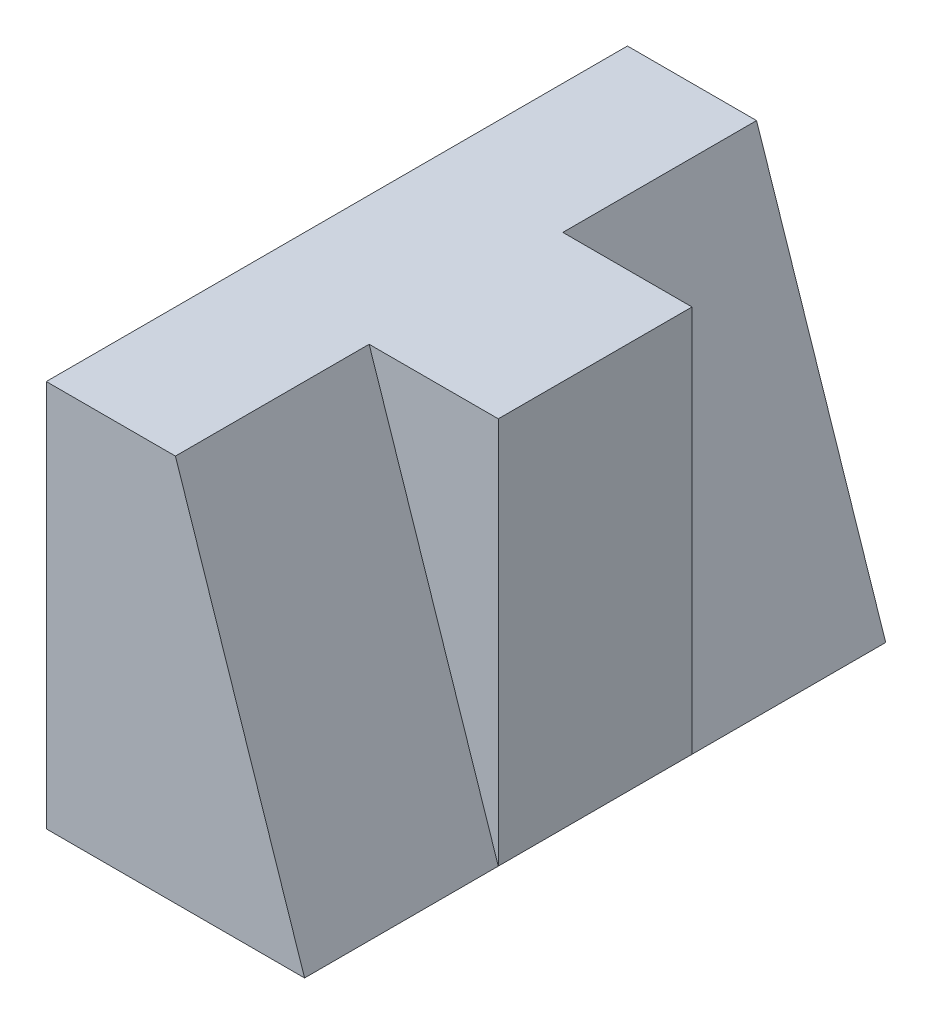
ISO-10303-21;
HEADER;
FILE_DESCRIPTION(('STEP AP214'),'2;1');
FILE_NAME('part.step','',(''),(''),'','','');
FILE_SCHEMA(('AUTOMOTIVE_DESIGN { 1 0 10303 214 1 1 1 1 }'));
ENDSEC;
DATA;
#1=APPLICATION_CONTEXT('core data for automotive mechanical design processes');
#2=APPLICATION_PROTOCOL_DEFINITION('international standard','automotive_design',2000,#1);
#3=PRODUCT_CONTEXT('',#1,'mechanical');
#4=PRODUCT('Part','Part','',(#3));
#5=PRODUCT_RELATED_PRODUCT_CATEGORY('part','',(#4));
#6=PRODUCT_DEFINITION_FORMATION('','',#4);
#7=PRODUCT_DEFINITION_CONTEXT('part definition',#1,'design');
#8=PRODUCT_DEFINITION('design','',#6,#7);
#9=PRODUCT_DEFINITION_SHAPE('','',#8);
#10=(LENGTH_UNIT() NAMED_UNIT(*) SI_UNIT(.MILLI.,.METRE.));
#11=(NAMED_UNIT(*) PLANE_ANGLE_UNIT() SI_UNIT($,.RADIAN.));
#12=(NAMED_UNIT(*) SI_UNIT($,.STERADIAN.) SOLID_ANGLE_UNIT());
#13=UNCERTAINTY_MEASURE_WITH_UNIT(LENGTH_MEASURE(1.E-05),#10,'distance_accuracy_value','');
#14=(GEOMETRIC_REPRESENTATION_CONTEXT(3) GLOBAL_UNCERTAINTY_ASSIGNED_CONTEXT((#13)) GLOBAL_UNIT_ASSIGNED_CONTEXT((#10,
#11,#12)) REPRESENTATION_CONTEXT('',''));
#15=CARTESIAN_POINT('',(0.,0.,0.));
#16=DIRECTION('',(0.,0.,1.));
#17=DIRECTION('',(1.,0.,0.));
#18=AXIS2_PLACEMENT_3D('',#15,#16,#17);
#19=CARTESIAN_POINT('',(36.,12.,45.));
#20=DIRECTION('',(0.948683298050514,0.316227766016838,0.));
#21=DIRECTION('',(-0.316227766016838,0.948683298050514,0.));
#22=AXIS2_PLACEMENT_3D('',#19,#20,#21);
#23=PLANE('',#22);
#24=DIRECTION('',(0.,0.,-1.));
#25=VECTOR('',#24,1.);
#26=CARTESIAN_POINT('',(20.,60.,45.));
#27=LINE('',#26,#25);
#28=CARTESIAN_POINT('',(20.,60.,-15.));
#29=VERTEX_POINT('',#28);
#30=CARTESIAN_POINT('',(20.,60.,-45.));
#31=VERTEX_POINT('',#30);
#32=EDGE_CURVE('E44',#29,#31,#27,.T.);
#33=ORIENTED_EDGE('',*,*,#32,.F.);
#34=DIRECTION('',(0.316227766016838,-0.948683298050514,0.));
#35=VECTOR('',#34,1.);
#36=CARTESIAN_POINT('',(36.,12.,-15.));
#37=LINE('',#36,#35);
#38=CARTESIAN_POINT('',(40.,0.,-15.));
#39=VERTEX_POINT('',#38);
#40=EDGE_CURVE('E52',#29,#39,#37,.T.);
#41=ORIENTED_EDGE('',*,*,#40,.T.);
#42=DIRECTION('',(0.,0.,-1.));
#43=VECTOR('',#42,1.);
#44=CARTESIAN_POINT('',(40.,0.,45.));
#45=LINE('',#44,#43);
#46=CARTESIAN_POINT('',(40.,0.,-45.));
#47=VERTEX_POINT('',#46);
#48=EDGE_CURVE('E102',#39,#47,#45,.T.);
#49=ORIENTED_EDGE('',*,*,#48,.T.);
#50=DIRECTION('',(0.316227766016838,-0.948683298050514,0.));
#51=VECTOR('',#50,1.);
#52=CARTESIAN_POINT('',(36.,12.,-45.));
#53=LINE('',#52,#51);
#54=EDGE_CURVE('E111',#31,#47,#53,.T.);
#55=ORIENTED_EDGE('',*,*,#54,.F.);
#56=EDGE_LOOP('',(#33,#41,#49,#55));
#57=FACE_BOUND('',#56,.T.);
#58=ADVANCED_FACE('F35',(#57),#23,.T.);
#59=DIRECTION('',(0.316227766016838,-0.948683298050514,0.));
#60=VECTOR('',#59,1.);
#61=CARTESIAN_POINT('',(36.,12.,15.));
#62=LINE('',#61,#60);
#63=CARTESIAN_POINT('',(20.,60.,15.));
#64=VERTEX_POINT('',#63);
#65=CARTESIAN_POINT('',(40.,0.,15.));
#66=VERTEX_POINT('',#65);
#67=EDGE_CURVE('E96',#64,#66,#62,.T.);
#68=ORIENTED_EDGE('',*,*,#67,.F.);
#69=CARTESIAN_POINT('',(20.,60.,45.));
#70=VERTEX_POINT('',#69);
#71=EDGE_CURVE('E11',#70,#64,#27,.T.);
#72=ORIENTED_EDGE('',*,*,#71,.F.);
#73=DIRECTION('',(0.316227766016838,-0.948683298050514,0.));
#74=VECTOR('',#73,1.);
#75=CARTESIAN_POINT('',(36.,12.,45.));
#76=LINE('',#75,#74);
#77=CARTESIAN_POINT('',(40.,0.,45.));
#78=VERTEX_POINT('',#77);
#79=EDGE_CURVE('E98',#70,#78,#76,.T.);
#80=ORIENTED_EDGE('',*,*,#79,.T.);
#81=EDGE_CURVE('E93',#78,#66,#45,.T.);
#82=ORIENTED_EDGE('',*,*,#81,.T.);
#83=EDGE_LOOP('',(#68,#72,#80,#82));
#84=FACE_BOUND('',#83,.T.);
#85=ADVANCED_FACE('F37',(#84),#23,.T.);
#86=CARTESIAN_POINT('',(0.,60.,45.));
#87=DIRECTION('',(0.,1.,0.));
#88=DIRECTION('',(0.,0.,1.));
#89=AXIS2_PLACEMENT_3D('',#86,#87,#88);
#90=PLANE('',#89);
#91=DIRECTION('',(1.,0.,0.));
#92=VECTOR('',#91,1.);
#93=CARTESIAN_POINT('',(0.,60.,-45.));
#94=LINE('',#93,#92);
#95=CARTESIAN_POINT('',(0.,60.,-45.));
#96=VERTEX_POINT('',#95);
#97=EDGE_CURVE('E155',#96,#31,#94,.T.);
#98=ORIENTED_EDGE('',*,*,#97,.F.);
#99=DIRECTION('',(0.,0.,-1.));
#100=VECTOR('',#99,1.);
#101=CARTESIAN_POINT('',(0.,60.,45.));
#102=LINE('',#101,#100);
#103=CARTESIAN_POINT('',(0.,60.,45.));
#104=VERTEX_POINT('',#103);
#105=EDGE_CURVE('E169',#104,#96,#102,.T.);
#106=ORIENTED_EDGE('',*,*,#105,.F.);
#107=DIRECTION('',(1.,0.,0.));
#108=VECTOR('',#107,1.);
#109=CARTESIAN_POINT('',(0.,60.,45.));
#110=LINE('',#109,#108);
#111=EDGE_CURVE('E144',#104,#70,#110,.T.);
#112=ORIENTED_EDGE('',*,*,#111,.T.);
#113=ORIENTED_EDGE('',*,*,#71,.T.);
#114=DIRECTION('',(-1.,0.,0.));
#115=VECTOR('',#114,1.);
#116=CARTESIAN_POINT('',(0.,60.,15.));
#117=LINE('',#116,#115);
#118=CARTESIAN_POINT('',(40.,60.,15.));
#119=VERTEX_POINT('',#118);
#120=EDGE_CURVE('E120',#119,#64,#117,.T.);
#121=ORIENTED_EDGE('',*,*,#120,.F.);
#122=DIRECTION('',(0.,0.,-1.));
#123=VECTOR('',#122,1.);
#124=CARTESIAN_POINT('',(40.,60.,15.));
#125=LINE('',#124,#123);
#126=CARTESIAN_POINT('',(40.,60.,-15.));
#127=VERTEX_POINT('',#126);
#128=EDGE_CURVE('E112',#119,#127,#125,.T.);
#129=ORIENTED_EDGE('',*,*,#128,.T.);
#130=DIRECTION('',(-1.,0.,0.));
#131=VECTOR('',#130,1.);
#132=CARTESIAN_POINT('',(0.,60.,-15.));
#133=LINE('',#132,#131);
#134=EDGE_CURVE('E137',#127,#29,#133,.T.);
#135=ORIENTED_EDGE('',*,*,#134,.T.);
#136=ORIENTED_EDGE('',*,*,#32,.T.);
#137=EDGE_LOOP('',(#98,#106,#112,#113,#121,#129,#135,#136));
#138=FACE_BOUND('',#137,.T.);
#139=ADVANCED_FACE('F181',(#138),#90,.T.);
#140=CARTESIAN_POINT('',(0.,0.,45.));
#141=DIRECTION('',(-1.,0.,0.));
#142=DIRECTION('',(0.,0.,1.));
#143=AXIS2_PLACEMENT_3D('',#140,#141,#142);
#144=PLANE('',#143);
#145=DIRECTION('',(0.,1.,0.));
#146=VECTOR('',#145,1.);
#147=CARTESIAN_POINT('',(0.,0.,-45.));
#148=LINE('',#147,#146);
#149=CARTESIAN_POINT('',(0.,0.,-45.));
#150=VERTEX_POINT('',#149);
#151=EDGE_CURVE('E158',#150,#96,#148,.T.);
#152=ORIENTED_EDGE('',*,*,#151,.F.);
#153=DIRECTION('',(0.,0.,-1.));
#154=VECTOR('',#153,1.);
#155=CARTESIAN_POINT('',(0.,0.,45.));
#156=LINE('',#155,#154);
#157=CARTESIAN_POINT('',(0.,0.,45.));
#158=VERTEX_POINT('',#157);
#159=EDGE_CURVE('E101',#158,#150,#156,.T.);
#160=ORIENTED_EDGE('',*,*,#159,.F.);
#161=DIRECTION('',(0.,1.,0.));
#162=VECTOR('',#161,1.);
#163=CARTESIAN_POINT('',(0.,0.,45.));
#164=LINE('',#163,#162);
#165=EDGE_CURVE('E148',#158,#104,#164,.T.);
#166=ORIENTED_EDGE('',*,*,#165,.T.);
#167=ORIENTED_EDGE('',*,*,#105,.T.);
#168=EDGE_LOOP('',(#152,#160,#166,#167));
#169=FACE_BOUND('',#168,.T.);
#170=ADVANCED_FACE('F179',(#169),#144,.T.);
#171=CARTESIAN_POINT('',(0.,0.,45.));
#172=DIRECTION('',(0.,1.,0.));
#173=DIRECTION('',(0.,0.,1.));
#174=AXIS2_PLACEMENT_3D('',#171,#172,#173);
#175=PLANE('',#174);
#176=DIRECTION('',(1.,0.,0.));
#177=VECTOR('',#176,1.);
#178=CARTESIAN_POINT('',(0.,0.,-45.));
#179=LINE('',#178,#177);
#180=EDGE_CURVE('E145',#150,#47,#179,.T.);
#181=ORIENTED_EDGE('',*,*,#180,.T.);
#182=ORIENTED_EDGE('',*,*,#48,.F.);
#183=DIRECTION('',(0.,0.,-1.));
#184=VECTOR('',#183,1.);
#185=CARTESIAN_POINT('',(40.,0.,15.));
#186=LINE('',#185,#184);
#187=EDGE_CURVE('E105',#66,#39,#186,.T.);
#188=ORIENTED_EDGE('',*,*,#187,.F.);
#189=ORIENTED_EDGE('',*,*,#81,.F.);
#190=DIRECTION('',(1.,0.,0.));
#191=VECTOR('',#190,1.);
#192=CARTESIAN_POINT('',(0.,0.,45.));
#193=LINE('',#192,#191);
#194=EDGE_CURVE('E151',#158,#78,#193,.T.);
#195=ORIENTED_EDGE('',*,*,#194,.F.);
#196=ORIENTED_EDGE('',*,*,#159,.T.);
#197=EDGE_LOOP('',(#181,#182,#188,#189,#195,#196));
#198=FACE_BOUND('',#197,.T.);
#199=ADVANCED_FACE('F107',(#198),#175,.F.);
#200=CARTESIAN_POINT('',(0.,0.,45.));
#201=DIRECTION('',(0.,0.,1.));
#202=DIRECTION('',(1.,0.,0.));
#203=AXIS2_PLACEMENT_3D('',#200,#201,#202);
#204=PLANE('',#203);
#205=ORIENTED_EDGE('',*,*,#79,.F.);
#206=ORIENTED_EDGE('',*,*,#111,.F.);
#207=ORIENTED_EDGE('',*,*,#165,.F.);
#208=ORIENTED_EDGE('',*,*,#194,.T.);
#209=EDGE_LOOP('',(#205,#206,#207,#208));
#210=FACE_BOUND('',#209,.T.);
#211=ADVANCED_FACE('F187',(#210),#204,.T.);
#212=CARTESIAN_POINT('',(0.,0.,-45.));
#213=DIRECTION('',(0.,0.,1.));
#214=DIRECTION('',(1.,0.,0.));
#215=AXIS2_PLACEMENT_3D('',#212,#213,#214);
#216=PLANE('',#215);
#217=ORIENTED_EDGE('',*,*,#54,.T.);
#218=ORIENTED_EDGE('',*,*,#180,.F.);
#219=ORIENTED_EDGE('',*,*,#151,.T.);
#220=ORIENTED_EDGE('',*,*,#97,.T.);
#221=EDGE_LOOP('',(#217,#218,#219,#220));
#222=FACE_BOUND('',#221,.T.);
#223=ADVANCED_FACE('F178',(#222),#216,.F.);
#224=CARTESIAN_POINT('',(40.,0.,15.));
#225=DIRECTION('',(-1.,0.,0.));
#226=DIRECTION('',(0.,0.,1.));
#227=AXIS2_PLACEMENT_3D('',#224,#225,#226);
#228=PLANE('',#227);
#229=DIRECTION('',(0.,1.,0.));
#230=VECTOR('',#229,1.);
#231=CARTESIAN_POINT('',(40.,0.,-15.));
#232=LINE('',#231,#230);
#233=EDGE_CURVE('E132',#39,#127,#232,.T.);
#234=ORIENTED_EDGE('',*,*,#233,.T.);
#235=ORIENTED_EDGE('',*,*,#128,.F.);
#236=DIRECTION('',(0.,1.,0.));
#237=VECTOR('',#236,1.);
#238=CARTESIAN_POINT('',(40.,0.,15.));
#239=LINE('',#238,#237);
#240=EDGE_CURVE('E117',#66,#119,#239,.T.);
#241=ORIENTED_EDGE('',*,*,#240,.F.);
#242=ORIENTED_EDGE('',*,*,#187,.T.);
#243=EDGE_LOOP('',(#234,#235,#241,#242));
#244=FACE_BOUND('',#243,.T.);
#245=ADVANCED_FACE('F122',(#244),#228,.F.);
#246=CARTESIAN_POINT('',(0.,0.,15.));
#247=DIRECTION('',(0.,0.,1.));
#248=DIRECTION('',(1.,0.,0.));
#249=AXIS2_PLACEMENT_3D('',#246,#247,#248);
#250=PLANE('',#249);
#251=ORIENTED_EDGE('',*,*,#120,.T.);
#252=ORIENTED_EDGE('',*,*,#67,.T.);
#253=ORIENTED_EDGE('',*,*,#240,.T.);
#254=EDGE_LOOP('',(#251,#252,#253));
#255=FACE_BOUND('',#254,.T.);
#256=ADVANCED_FACE('F116',(#255),#250,.T.);
#257=CARTESIAN_POINT('',(0.,0.,-15.));
#258=DIRECTION('',(0.,0.,1.));
#259=DIRECTION('',(1.,0.,0.));
#260=AXIS2_PLACEMENT_3D('',#257,#258,#259);
#261=PLANE('',#260);
#262=ORIENTED_EDGE('',*,*,#134,.F.);
#263=ORIENTED_EDGE('',*,*,#233,.F.);
#264=ORIENTED_EDGE('',*,*,#40,.F.);
#265=EDGE_LOOP('',(#262,#263,#264));
#266=FACE_BOUND('',#265,.T.);
#267=ADVANCED_FACE('F228',(#266),#261,.F.);
#268=CLOSED_SHELL('',(#58,#85,#139,#170,#199,#211,#223,#245,#256,#267));
#269=MANIFOLD_SOLID_BREP('B2',#268);
#270=ADVANCED_BREP_SHAPE_REPRESENTATION('',(#18,#269),#14);
#271=SHAPE_DEFINITION_REPRESENTATION(#9,#270);
ENDSEC;
END-ISO-10303-21;
